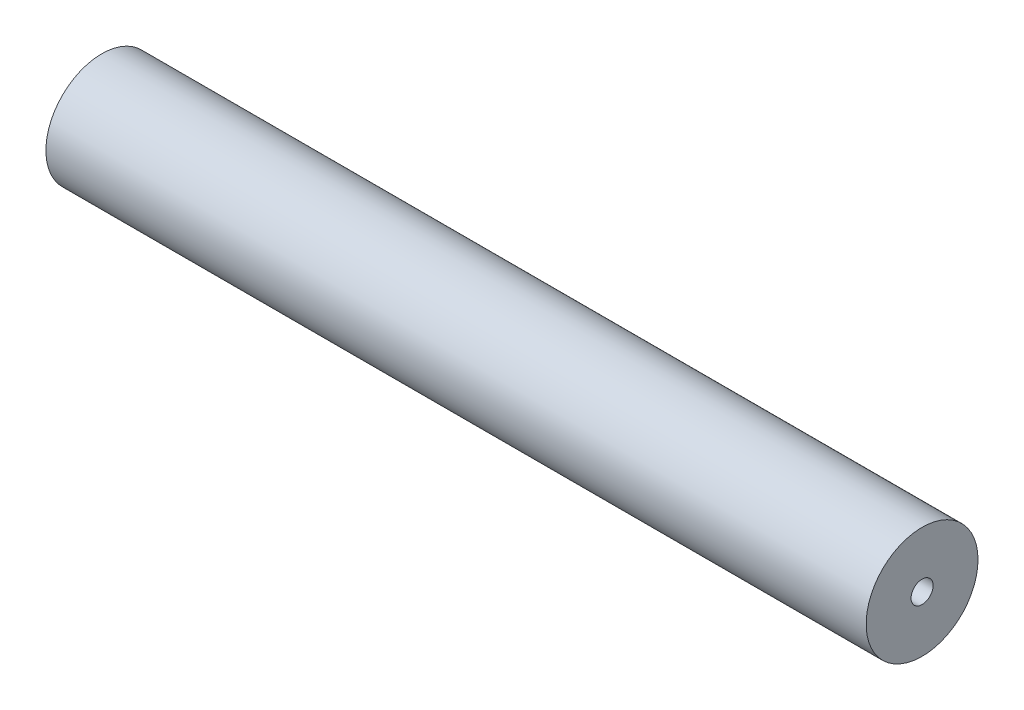
ISO-10303-21;
HEADER;
FILE_DESCRIPTION(('STEP AP214'),'2;1');
FILE_NAME('part.step','',(''),(''),'','','');
FILE_SCHEMA(('AUTOMOTIVE_DESIGN { 1 0 10303 214 1 1 1 1 }'));
ENDSEC;
DATA;
#1=APPLICATION_CONTEXT('core data for automotive mechanical design processes');
#2=APPLICATION_PROTOCOL_DEFINITION('international standard','automotive_design',2000,#1);
#3=PRODUCT_CONTEXT('',#1,'mechanical');
#4=PRODUCT('Part','Part','',(#3));
#5=PRODUCT_RELATED_PRODUCT_CATEGORY('part','',(#4));
#6=PRODUCT_DEFINITION_FORMATION('','',#4);
#7=PRODUCT_DEFINITION_CONTEXT('part definition',#1,'design');
#8=PRODUCT_DEFINITION('design','',#6,#7);
#9=PRODUCT_DEFINITION_SHAPE('','',#8);
#10=(LENGTH_UNIT() NAMED_UNIT(*) SI_UNIT(.MILLI.,.METRE.));
#11=(NAMED_UNIT(*) PLANE_ANGLE_UNIT() SI_UNIT($,.RADIAN.));
#12=(NAMED_UNIT(*) SI_UNIT($,.STERADIAN.) SOLID_ANGLE_UNIT());
#13=UNCERTAINTY_MEASURE_WITH_UNIT(LENGTH_MEASURE(1.E-05),#10,'distance_accuracy_value','');
#14=(GEOMETRIC_REPRESENTATION_CONTEXT(3) GLOBAL_UNCERTAINTY_ASSIGNED_CONTEXT((#13)) GLOBAL_UNIT_ASSIGNED_CONTEXT((#10,
#11,#12)) REPRESENTATION_CONTEXT('',''));
#15=CARTESIAN_POINT('',(0.,0.,0.));
#16=DIRECTION('',(0.,0.,1.));
#17=DIRECTION('',(1.,0.,0.));
#18=AXIS2_PLACEMENT_3D('',#15,#16,#17);
#19=CARTESIAN_POINT('',(558.8,0.,0.));
#20=DIRECTION('',(-1.,0.,0.));
#21=DIRECTION('',(0.,0.,1.));
#22=AXIS2_PLACEMENT_3D('',#19,#20,#21);
#23=CYLINDRICAL_SURFACE('',#22,38.1);
#24=CARTESIAN_POINT('',(558.8,0.,0.));
#25=DIRECTION('',(1.,0.,0.));
#26=DIRECTION('',(0.,0.,-1.));
#27=AXIS2_PLACEMENT_3D('',#24,#25,#26);
#28=CIRCLE('',#27,38.1);
#29=CARTESIAN_POINT('',(558.8,0.,-38.1));
#30=VERTEX_POINT('',#29);
#31=EDGE_CURVE('E11',#30,#30,#28,.T.);
#32=ORIENTED_EDGE('',*,*,#31,.F.);
#33=EDGE_LOOP('',(#32));
#34=FACE_BOUND('',#33,.T.);
#35=CARTESIAN_POINT('',(0.,0.,0.));
#36=DIRECTION('',(1.,0.,0.));
#37=DIRECTION('',(0.,0.,-1.));
#38=AXIS2_PLACEMENT_3D('',#35,#36,#37);
#39=CIRCLE('',#38,38.1);
#40=CARTESIAN_POINT('',(0.,0.,-38.1));
#41=VERTEX_POINT('',#40);
#42=EDGE_CURVE('E45',#41,#41,#39,.T.);
#43=ORIENTED_EDGE('',*,*,#42,.T.);
#44=EDGE_LOOP('',(#43));
#45=FACE_BOUND('',#44,.T.);
#46=ADVANCED_FACE('F42',(#34,#45),#23,.T.);
#47=CARTESIAN_POINT('',(558.8,0.,0.));
#48=DIRECTION('',(1.,0.,0.));
#49=DIRECTION('',(0.,0.,-1.));
#50=AXIS2_PLACEMENT_3D('',#47,#48,#49);
#51=PLANE('',#50);
#52=CARTESIAN_POINT('',(558.8,0.,0.));
#53=DIRECTION('',(1.,0.,0.));
#54=DIRECTION('',(0.,0.,-1.));
#55=AXIS2_PLACEMENT_3D('',#52,#53,#54);
#56=CIRCLE('',#55,7.49999999999999);
#57=CARTESIAN_POINT('',(558.8,0.,-7.49999999999999));
#58=VERTEX_POINT('',#57);
#59=EDGE_CURVE('E66',#58,#58,#56,.T.);
#60=ORIENTED_EDGE('',*,*,#59,.F.);
#61=EDGE_LOOP('',(#60));
#62=FACE_BOUND('',#61,.T.);
#63=ORIENTED_EDGE('',*,*,#31,.T.);
#64=EDGE_LOOP('',(#63));
#65=FACE_BOUND('',#64,.T.);
#66=ADVANCED_FACE('F87',(#62,#65),#51,.T.);
#67=CARTESIAN_POINT('',(0.,0.,0.));
#68=DIRECTION('',(1.,0.,0.));
#69=DIRECTION('',(0.,0.,-1.));
#70=AXIS2_PLACEMENT_3D('',#67,#68,#69);
#71=PLANE('',#70);
#72=CARTESIAN_POINT('',(0.,0.,0.));
#73=DIRECTION('',(-1.,0.,0.));
#74=DIRECTION('',(0.,0.,1.));
#75=AXIS2_PLACEMENT_3D('',#72,#73,#74);
#76=CIRCLE('',#75,6.775);
#77=CARTESIAN_POINT('',(0.,0.,6.775));
#78=VERTEX_POINT('',#77);
#79=EDGE_CURVE('E65',#78,#78,#76,.T.);
#80=ORIENTED_EDGE('',*,*,#79,.F.);
#81=EDGE_LOOP('',(#80));
#82=FACE_BOUND('',#81,.T.);
#83=ORIENTED_EDGE('',*,*,#42,.F.);
#84=EDGE_LOOP('',(#83));
#85=FACE_BOUND('',#84,.T.);
#86=ADVANCED_FACE('F84',(#82,#85),#71,.F.);
#87=CARTESIAN_POINT('',(21.344190821564,0.,0.));
#88=DIRECTION('',(-1.,0.,0.));
#89=DIRECTION('',(0.,0.,1.));
#90=AXIS2_PLACEMENT_3D('',#87,#88,#89);
#91=CONICAL_SURFACE('',#90,6.74999999999999,1.02974425867665);
#92=CARTESIAN_POINT('',(25.4,0.,0.));
#93=VERTEX_POINT('',#92);
#94=VERTEX_LOOP('',#93);
#95=FACE_BOUND('',#94,.T.);
#96=CARTESIAN_POINT('',(21.344190821564,0.,0.));
#97=DIRECTION('',(-1.,0.,0.));
#98=DIRECTION('',(0.,0.,1.));
#99=AXIS2_PLACEMENT_3D('',#96,#97,#98);
#100=CIRCLE('',#99,6.74999999999999);
#101=CARTESIAN_POINT('',(21.344190821564,0.,6.74999999999999));
#102=VERTEX_POINT('',#101);
#103=EDGE_CURVE('E76',#102,#102,#100,.T.);
#104=ORIENTED_EDGE('',*,*,#103,.T.);
#105=EDGE_LOOP('',(#104));
#106=FACE_BOUND('',#105,.T.);
#107=ADVANCED_FACE('F86',(#95,#106),#91,.F.);
#108=CARTESIAN_POINT('',(0.,0.,0.));
#109=DIRECTION('',(-1.,0.,0.));
#110=DIRECTION('',(0.,0.,1.));
#111=AXIS2_PLACEMENT_3D('',#108,#109,#110);
#112=CYLINDRICAL_SURFACE('',#111,6.75);
#113=ORIENTED_EDGE('',*,*,#103,.F.);
#114=EDGE_LOOP('',(#113));
#115=FACE_BOUND('',#114,.T.);
#116=CARTESIAN_POINT('',(0.0250000000000042,0.,0.));
#117=DIRECTION('',(-1.,0.,0.));
#118=DIRECTION('',(0.,0.,1.));
#119=AXIS2_PLACEMENT_3D('',#116,#117,#118);
#120=CIRCLE('',#119,6.75);
#121=CARTESIAN_POINT('',(0.0250000000000042,0.,6.75));
#122=VERTEX_POINT('',#121);
#123=EDGE_CURVE('E69',#122,#122,#120,.T.);
#124=ORIENTED_EDGE('',*,*,#123,.T.);
#125=EDGE_LOOP('',(#124));
#126=FACE_BOUND('',#125,.T.);
#127=ADVANCED_FACE('F94',(#115,#126),#112,.F.);
#128=CARTESIAN_POINT('',(0.,0.,0.));
#129=DIRECTION('',(-1.,0.,0.));
#130=DIRECTION('',(0.,0.,1.));
#131=AXIS2_PLACEMENT_3D('',#128,#129,#130);
#132=CONICAL_SURFACE('',#131,6.775,0.785398163397396);
#133=ORIENTED_EDGE('',*,*,#123,.F.);
#134=EDGE_LOOP('',(#133));
#135=FACE_BOUND('',#134,.T.);
#136=ORIENTED_EDGE('',*,*,#79,.T.);
#137=EDGE_LOOP('',(#136));
#138=FACE_BOUND('',#137,.T.);
#139=ADVANCED_FACE('F59',(#135,#138),#132,.F.);
#140=CARTESIAN_POINT('',(537.906454642707,0.,0.));
#141=DIRECTION('',(1.,0.,0.));
#142=DIRECTION('',(0.,0.,-1.));
#143=AXIS2_PLACEMENT_3D('',#140,#141,#142);
#144=CONICAL_SURFACE('',#143,7.49999999999999,1.02974425867665);
#145=CARTESIAN_POINT('',(533.4,0.,0.));
#146=VERTEX_POINT('',#145);
#147=VERTEX_LOOP('',#146);
#148=FACE_BOUND('',#147,.T.);
#149=CARTESIAN_POINT('',(537.906454642707,0.,0.));
#150=DIRECTION('',(1.,0.,0.));
#151=DIRECTION('',(0.,0.,-1.));
#152=AXIS2_PLACEMENT_3D('',#149,#150,#151);
#153=CIRCLE('',#152,7.49999999999999);
#154=CARTESIAN_POINT('',(537.906454642707,0.,-7.49999999999999));
#155=VERTEX_POINT('',#154);
#156=EDGE_CURVE('E63',#155,#155,#153,.T.);
#157=ORIENTED_EDGE('',*,*,#156,.T.);
#158=EDGE_LOOP('',(#157));
#159=FACE_BOUND('',#158,.T.);
#160=ADVANCED_FACE('F55',(#148,#159),#144,.F.);
#161=CARTESIAN_POINT('',(558.8,0.,0.));
#162=DIRECTION('',(1.,0.,0.));
#163=DIRECTION('',(0.,0.,-1.));
#164=AXIS2_PLACEMENT_3D('',#161,#162,#163);
#165=CYLINDRICAL_SURFACE('',#164,7.49999999999999);
#166=ORIENTED_EDGE('',*,*,#156,.F.);
#167=EDGE_LOOP('',(#166));
#168=FACE_BOUND('',#167,.T.);
#169=ORIENTED_EDGE('',*,*,#59,.T.);
#170=EDGE_LOOP('',(#169));
#171=FACE_BOUND('',#170,.T.);
#172=ADVANCED_FACE('F58',(#168,#171),#165,.F.);
#173=CLOSED_SHELL('',(#46,#66,#86,#107,#127,#139,#160,#172));
#174=MANIFOLD_SOLID_BREP('B2',#173);
#175=ADVANCED_BREP_SHAPE_REPRESENTATION('',(#18,#174),#14);
#176=SHAPE_DEFINITION_REPRESENTATION(#9,#175);
ENDSEC;
END-ISO-10303-21;
